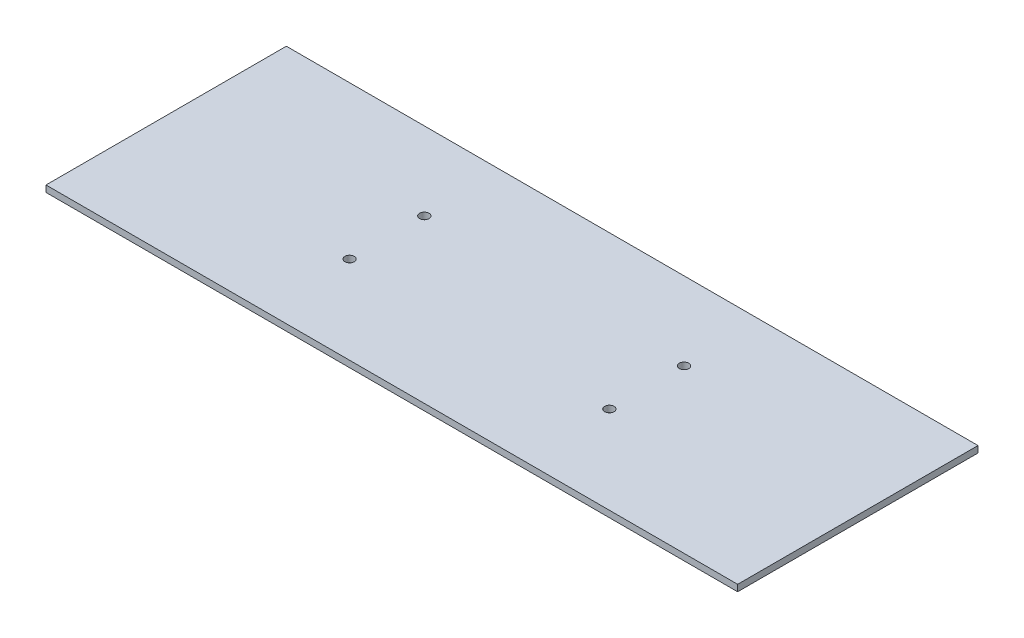
ISO-10303-21;
HEADER;
FILE_DESCRIPTION(('STEP AP214'),'2;1');
FILE_NAME('part.step','',(''),(''),'','','');
FILE_SCHEMA(('AUTOMOTIVE_DESIGN { 1 0 10303 214 1 1 1 1 }'));
ENDSEC;
DATA;
#1=APPLICATION_CONTEXT('core data for automotive mechanical design processes');
#2=APPLICATION_PROTOCOL_DEFINITION('international standard','automotive_design',2000,#1);
#3=PRODUCT_CONTEXT('',#1,'mechanical');
#4=PRODUCT('Part','Part','',(#3));
#5=PRODUCT_RELATED_PRODUCT_CATEGORY('part','',(#4));
#6=PRODUCT_DEFINITION_FORMATION('','',#4);
#7=PRODUCT_DEFINITION_CONTEXT('part definition',#1,'design');
#8=PRODUCT_DEFINITION('design','',#6,#7);
#9=PRODUCT_DEFINITION_SHAPE('','',#8);
#10=(LENGTH_UNIT() NAMED_UNIT(*) SI_UNIT(.MILLI.,.METRE.));
#11=(NAMED_UNIT(*) PLANE_ANGLE_UNIT() SI_UNIT($,.RADIAN.));
#12=(NAMED_UNIT(*) SI_UNIT($,.STERADIAN.) SOLID_ANGLE_UNIT());
#13=UNCERTAINTY_MEASURE_WITH_UNIT(LENGTH_MEASURE(1.E-05),#10,'distance_accuracy_value','');
#14=(GEOMETRIC_REPRESENTATION_CONTEXT(3) GLOBAL_UNCERTAINTY_ASSIGNED_CONTEXT((#13)) GLOBAL_UNIT_ASSIGNED_CONTEXT((#10,
#11,#12)) REPRESENTATION_CONTEXT('',''));
#15=CARTESIAN_POINT('',(0.,0.,0.));
#16=DIRECTION('',(0.,0.,1.));
#17=DIRECTION('',(1.,0.,0.));
#18=AXIS2_PLACEMENT_3D('',#15,#16,#17);
#19=CARTESIAN_POINT('',(0.,2.,0.));
#20=DIRECTION('',(0.,-1.,0.));
#21=DIRECTION('',(0.,0.,-1.));
#22=AXIS2_PLACEMENT_3D('',#19,#20,#21);
#23=PLANE('',#22);
#24=DIRECTION('',(0.,0.,-1.));
#25=VECTOR('',#24,1.);
#26=CARTESIAN_POINT('',(106.505,2.,38.4957831325301));
#27=LINE('',#26,#25);
#28=CARTESIAN_POINT('',(106.505,2.,38.4957831325301));
#29=VERTEX_POINT('',#28);
#30=CARTESIAN_POINT('',(106.505,2.,-35.5242168674699));
#31=VERTEX_POINT('',#30);
#32=EDGE_CURVE('E92',#29,#31,#27,.T.);
#33=ORIENTED_EDGE('',*,*,#32,.T.);
#34=DIRECTION('',(-1.,0.,0.));
#35=VECTOR('',#34,1.);
#36=CARTESIAN_POINT('',(-106.505,2.,-35.5242168674699));
#37=LINE('',#36,#35);
#38=CARTESIAN_POINT('',(-106.505,2.,-35.5242168674699));
#39=VERTEX_POINT('',#38);
#40=EDGE_CURVE('E87',#31,#39,#37,.T.);
#41=ORIENTED_EDGE('',*,*,#40,.T.);
#42=DIRECTION('',(0.,0.,1.));
#43=VECTOR('',#42,1.);
#44=CARTESIAN_POINT('',(-106.505,2.,38.4957831325301));
#45=LINE('',#44,#43);
#46=CARTESIAN_POINT('',(-106.505,2.,38.4957831325301));
#47=VERTEX_POINT('',#46);
#48=EDGE_CURVE('E90',#39,#47,#45,.T.);
#49=ORIENTED_EDGE('',*,*,#48,.T.);
#50=DIRECTION('',(1.,0.,0.));
#51=VECTOR('',#50,1.);
#52=CARTESIAN_POINT('',(-106.505,2.,38.4957831325301));
#53=LINE('',#52,#51);
#54=EDGE_CURVE('E57',#47,#29,#53,.T.);
#55=ORIENTED_EDGE('',*,*,#54,.T.);
#56=EDGE_LOOP('',(#33,#41,#49,#55));
#57=FACE_BOUND('',#56,.T.);
#58=CARTESIAN_POINT('',(-40.,2.,-11.5));
#59=DIRECTION('',(0.,1.,0.));
#60=DIRECTION('',(0.,0.,1.));
#61=AXIS2_PLACEMENT_3D('',#58,#59,#60);
#62=CIRCLE('',#61,1.45);
#63=CARTESIAN_POINT('',(-40.,2.,-10.05));
#64=VERTEX_POINT('',#63);
#65=EDGE_CURVE('E112',#64,#64,#62,.T.);
#66=ORIENTED_EDGE('',*,*,#65,.F.);
#67=EDGE_LOOP('',(#66));
#68=FACE_BOUND('',#67,.T.);
#69=CARTESIAN_POINT('',(-40.,2.,11.5));
#70=DIRECTION('',(0.,1.,0.));
#71=DIRECTION('',(0.,0.,1.));
#72=AXIS2_PLACEMENT_3D('',#69,#70,#71);
#73=CIRCLE('',#72,1.45);
#74=CARTESIAN_POINT('',(-40.,2.,12.95));
#75=VERTEX_POINT('',#74);
#76=EDGE_CURVE('E134',#75,#75,#73,.T.);
#77=ORIENTED_EDGE('',*,*,#76,.F.);
#78=EDGE_LOOP('',(#77));
#79=FACE_BOUND('',#78,.T.);
#80=CARTESIAN_POINT('',(40.,2.,11.5));
#81=DIRECTION('',(0.,1.,0.));
#82=DIRECTION('',(0.,0.,-1.));
#83=AXIS2_PLACEMENT_3D('',#80,#81,#82);
#84=CIRCLE('',#83,1.45);
#85=CARTESIAN_POINT('',(40.,2.,10.05));
#86=VERTEX_POINT('',#85);
#87=EDGE_CURVE('E142',#86,#86,#84,.T.);
#88=ORIENTED_EDGE('',*,*,#87,.F.);
#89=EDGE_LOOP('',(#88));
#90=FACE_BOUND('',#89,.T.);
#91=CARTESIAN_POINT('',(40.,2.,-11.5));
#92=DIRECTION('',(0.,1.,0.));
#93=DIRECTION('',(0.,0.,-1.));
#94=AXIS2_PLACEMENT_3D('',#91,#92,#93);
#95=CIRCLE('',#94,1.45);
#96=CARTESIAN_POINT('',(40.,2.,-12.95));
#97=VERTEX_POINT('',#96);
#98=EDGE_CURVE('E150',#97,#97,#95,.T.);
#99=ORIENTED_EDGE('',*,*,#98,.F.);
#100=EDGE_LOOP('',(#99));
#101=FACE_BOUND('',#100,.T.);
#102=ADVANCED_FACE('F39',(#57,#68,#79,#90,#101),#23,.F.);
#103=CARTESIAN_POINT('',(0.,0.,0.));
#104=DIRECTION('',(0.,-1.,0.));
#105=DIRECTION('',(0.,0.,-1.));
#106=AXIS2_PLACEMENT_3D('',#103,#104,#105);
#107=PLANE('',#106);
#108=CARTESIAN_POINT('',(40.,0.,11.5));
#109=DIRECTION('',(0.,1.,0.));
#110=DIRECTION('',(0.,0.,-1.));
#111=AXIS2_PLACEMENT_3D('',#108,#109,#110);
#112=CIRCLE('',#111,1.45);
#113=CARTESIAN_POINT('',(40.,0.,10.05));
#114=VERTEX_POINT('',#113);
#115=EDGE_CURVE('E146',#114,#114,#112,.T.);
#116=ORIENTED_EDGE('',*,*,#115,.T.);
#117=EDGE_LOOP('',(#116));
#118=FACE_BOUND('',#117,.T.);
#119=CARTESIAN_POINT('',(-40.,0.,-11.5));
#120=DIRECTION('',(0.,1.,0.));
#121=DIRECTION('',(0.,0.,1.));
#122=AXIS2_PLACEMENT_3D('',#119,#120,#121);
#123=CIRCLE('',#122,1.45);
#124=CARTESIAN_POINT('',(-40.,0.,-10.05));
#125=VERTEX_POINT('',#124);
#126=EDGE_CURVE('E130',#125,#125,#123,.T.);
#127=ORIENTED_EDGE('',*,*,#126,.T.);
#128=EDGE_LOOP('',(#127));
#129=FACE_BOUND('',#128,.T.);
#130=DIRECTION('',(0.,0.,-1.));
#131=VECTOR('',#130,1.);
#132=CARTESIAN_POINT('',(106.505,0.,38.4957831325301));
#133=LINE('',#132,#131);
#134=CARTESIAN_POINT('',(106.505,0.,38.4957831325301));
#135=VERTEX_POINT('',#134);
#136=CARTESIAN_POINT('',(106.505,0.,-35.5242168674699));
#137=VERTEX_POINT('',#136);
#138=EDGE_CURVE('E108',#135,#137,#133,.T.);
#139=ORIENTED_EDGE('',*,*,#138,.F.);
#140=DIRECTION('',(1.,0.,0.));
#141=VECTOR('',#140,1.);
#142=CARTESIAN_POINT('',(-106.505,0.,38.4957831325301));
#143=LINE('',#142,#141);
#144=CARTESIAN_POINT('',(-106.505,0.,38.4957831325301));
#145=VERTEX_POINT('',#144);
#146=EDGE_CURVE('E80',#145,#135,#143,.T.);
#147=ORIENTED_EDGE('',*,*,#146,.F.);
#148=DIRECTION('',(0.,0.,1.));
#149=VECTOR('',#148,1.);
#150=CARTESIAN_POINT('',(-106.505,0.,38.4957831325301));
#151=LINE('',#150,#149);
#152=CARTESIAN_POINT('',(-106.505,0.,-35.5242168674699));
#153=VERTEX_POINT('',#152);
#154=EDGE_CURVE('E74',#153,#145,#151,.T.);
#155=ORIENTED_EDGE('',*,*,#154,.F.);
#156=DIRECTION('',(-1.,0.,0.));
#157=VECTOR('',#156,1.);
#158=CARTESIAN_POINT('',(-106.505,0.,-35.5242168674699));
#159=LINE('',#158,#157);
#160=EDGE_CURVE('E97',#137,#153,#159,.T.);
#161=ORIENTED_EDGE('',*,*,#160,.F.);
#162=EDGE_LOOP('',(#139,#147,#155,#161));
#163=FACE_BOUND('',#162,.T.);
#164=CARTESIAN_POINT('',(-40.,0.,11.5));
#165=DIRECTION('',(0.,1.,0.));
#166=DIRECTION('',(0.,0.,1.));
#167=AXIS2_PLACEMENT_3D('',#164,#165,#166);
#168=CIRCLE('',#167,1.45);
#169=CARTESIAN_POINT('',(-40.,0.,12.95));
#170=VERTEX_POINT('',#169);
#171=EDGE_CURVE('E138',#170,#170,#168,.T.);
#172=ORIENTED_EDGE('',*,*,#171,.T.);
#173=EDGE_LOOP('',(#172));
#174=FACE_BOUND('',#173,.T.);
#175=CARTESIAN_POINT('',(40.,0.,-11.5));
#176=DIRECTION('',(0.,1.,0.));
#177=DIRECTION('',(0.,0.,-1.));
#178=AXIS2_PLACEMENT_3D('',#175,#176,#177);
#179=CIRCLE('',#178,1.45);
#180=CARTESIAN_POINT('',(40.,0.,-12.95));
#181=VERTEX_POINT('',#180);
#182=EDGE_CURVE('E154',#181,#181,#179,.T.);
#183=ORIENTED_EDGE('',*,*,#182,.T.);
#184=EDGE_LOOP('',(#183));
#185=FACE_BOUND('',#184,.T.);
#186=ADVANCED_FACE('F125',(#118,#129,#163,#174,#185),#107,.T.);
#187=CARTESIAN_POINT('',(106.505,2.,38.4957831325301));
#188=DIRECTION('',(-1.,0.,0.));
#189=DIRECTION('',(0.,0.,1.));
#190=AXIS2_PLACEMENT_3D('',#187,#188,#189);
#191=PLANE('',#190);
#192=ORIENTED_EDGE('',*,*,#138,.T.);
#193=DIRECTION('',(0.,-1.,0.));
#194=VECTOR('',#193,1.);
#195=CARTESIAN_POINT('',(106.505,2.,-35.5242168674699));
#196=LINE('',#195,#194);
#197=EDGE_CURVE('E11',#31,#137,#196,.T.);
#198=ORIENTED_EDGE('',*,*,#197,.F.);
#199=ORIENTED_EDGE('',*,*,#32,.F.);
#200=DIRECTION('',(0.,-1.,0.));
#201=VECTOR('',#200,1.);
#202=CARTESIAN_POINT('',(106.505,2.,38.4957831325301));
#203=LINE('',#202,#201);
#204=EDGE_CURVE('E104',#29,#135,#203,.T.);
#205=ORIENTED_EDGE('',*,*,#204,.T.);
#206=EDGE_LOOP('',(#192,#198,#199,#205));
#207=FACE_BOUND('',#206,.T.);
#208=ADVANCED_FACE('F41',(#207),#191,.F.);
#209=CARTESIAN_POINT('',(-106.505,2.,-35.5242168674699));
#210=DIRECTION('',(0.,0.,1.));
#211=DIRECTION('',(1.,0.,0.));
#212=AXIS2_PLACEMENT_3D('',#209,#210,#211);
#213=PLANE('',#212);
#214=ORIENTED_EDGE('',*,*,#160,.T.);
#215=DIRECTION('',(0.,-1.,0.));
#216=VECTOR('',#215,1.);
#217=CARTESIAN_POINT('',(-106.505,2.,-35.5242168674699));
#218=LINE('',#217,#216);
#219=EDGE_CURVE('E49',#39,#153,#218,.T.);
#220=ORIENTED_EDGE('',*,*,#219,.F.);
#221=ORIENTED_EDGE('',*,*,#40,.F.);
#222=ORIENTED_EDGE('',*,*,#197,.T.);
#223=EDGE_LOOP('',(#214,#220,#221,#222));
#224=FACE_BOUND('',#223,.T.);
#225=ADVANCED_FACE('F96',(#224),#213,.F.);
#226=CARTESIAN_POINT('',(-106.505,2.,38.4957831325301));
#227=DIRECTION('',(1.,0.,0.));
#228=DIRECTION('',(0.,0.,-1.));
#229=AXIS2_PLACEMENT_3D('',#226,#227,#228);
#230=PLANE('',#229);
#231=ORIENTED_EDGE('',*,*,#154,.T.);
#232=DIRECTION('',(0.,-1.,0.));
#233=VECTOR('',#232,1.);
#234=CARTESIAN_POINT('',(-106.505,2.,38.4957831325301));
#235=LINE('',#234,#233);
#236=EDGE_CURVE('E99',#47,#145,#235,.T.);
#237=ORIENTED_EDGE('',*,*,#236,.F.);
#238=ORIENTED_EDGE('',*,*,#48,.F.);
#239=ORIENTED_EDGE('',*,*,#219,.T.);
#240=EDGE_LOOP('',(#231,#237,#238,#239));
#241=FACE_BOUND('',#240,.T.);
#242=ADVANCED_FACE('F100',(#241),#230,.F.);
#243=CARTESIAN_POINT('',(-106.505,2.,38.4957831325301));
#244=DIRECTION('',(0.,0.,-1.));
#245=DIRECTION('',(-1.,0.,0.));
#246=AXIS2_PLACEMENT_3D('',#243,#244,#245);
#247=PLANE('',#246);
#248=ORIENTED_EDGE('',*,*,#146,.T.);
#249=ORIENTED_EDGE('',*,*,#204,.F.);
#250=ORIENTED_EDGE('',*,*,#54,.F.);
#251=ORIENTED_EDGE('',*,*,#236,.T.);
#252=EDGE_LOOP('',(#248,#249,#250,#251));
#253=FACE_BOUND('',#252,.T.);
#254=ADVANCED_FACE('F122',(#253),#247,.F.);
#255=CARTESIAN_POINT('',(-40.,2.,-11.5));
#256=DIRECTION('',(0.,-1.,0.));
#257=DIRECTION('',(0.,0.,-1.));
#258=AXIS2_PLACEMENT_3D('',#255,#256,#257);
#259=CYLINDRICAL_SURFACE('',#258,1.45);
#260=ORIENTED_EDGE('',*,*,#65,.T.);
#261=EDGE_LOOP('',(#260));
#262=FACE_BOUND('',#261,.T.);
#263=ORIENTED_EDGE('',*,*,#126,.F.);
#264=EDGE_LOOP('',(#263));
#265=FACE_BOUND('',#264,.T.);
#266=ADVANCED_FACE('F173',(#262,#265),#259,.F.);
#267=CARTESIAN_POINT('',(-40.,2.,11.5));
#268=DIRECTION('',(0.,-1.,0.));
#269=DIRECTION('',(0.,0.,-1.));
#270=AXIS2_PLACEMENT_3D('',#267,#268,#269);
#271=CYLINDRICAL_SURFACE('',#270,1.45);
#272=ORIENTED_EDGE('',*,*,#76,.T.);
#273=EDGE_LOOP('',(#272));
#274=FACE_BOUND('',#273,.T.);
#275=ORIENTED_EDGE('',*,*,#171,.F.);
#276=EDGE_LOOP('',(#275));
#277=FACE_BOUND('',#276,.T.);
#278=ADVANCED_FACE('F219',(#274,#277),#271,.F.);
#279=CARTESIAN_POINT('',(40.,2.,11.5));
#280=DIRECTION('',(0.,-1.,0.));
#281=DIRECTION('',(0.,0.,-1.));
#282=AXIS2_PLACEMENT_3D('',#279,#280,#281);
#283=CYLINDRICAL_SURFACE('',#282,1.45);
#284=ORIENTED_EDGE('',*,*,#87,.T.);
#285=EDGE_LOOP('',(#284));
#286=FACE_BOUND('',#285,.T.);
#287=ORIENTED_EDGE('',*,*,#115,.F.);
#288=EDGE_LOOP('',(#287));
#289=FACE_BOUND('',#288,.T.);
#290=ADVANCED_FACE('F227',(#286,#289),#283,.F.);
#291=CARTESIAN_POINT('',(40.,2.,-11.5));
#292=DIRECTION('',(0.,-1.,0.));
#293=DIRECTION('',(0.,0.,-1.));
#294=AXIS2_PLACEMENT_3D('',#291,#292,#293);
#295=CYLINDRICAL_SURFACE('',#294,1.45);
#296=ORIENTED_EDGE('',*,*,#98,.T.);
#297=EDGE_LOOP('',(#296));
#298=FACE_BOUND('',#297,.T.);
#299=ORIENTED_EDGE('',*,*,#182,.F.);
#300=EDGE_LOOP('',(#299));
#301=FACE_BOUND('',#300,.T.);
#302=ADVANCED_FACE('F162',(#298,#301),#295,.F.);
#303=CLOSED_SHELL('',(#102,#186,#208,#225,#242,#254,#266,#278,#290,#302));
#304=MANIFOLD_SOLID_BREP('B2',#303);
#305=ADVANCED_BREP_SHAPE_REPRESENTATION('',(#18,#304),#14);
#306=SHAPE_DEFINITION_REPRESENTATION(#9,#305);
ENDSEC;
END-ISO-10303-21;
